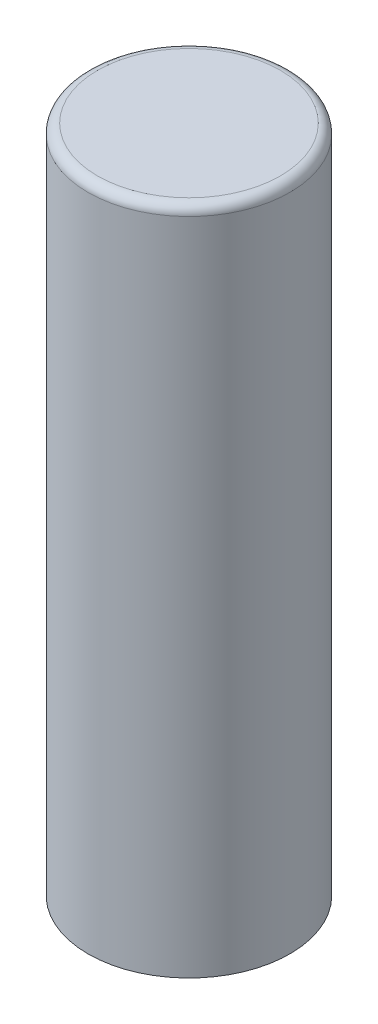
ISO-10303-21;
HEADER;
FILE_DESCRIPTION(('STEP AP214'),'2;1');
FILE_NAME('part.step','',(''),(''),'','','');
FILE_SCHEMA(('AUTOMOTIVE_DESIGN { 1 0 10303 214 1 1 1 1 }'));
ENDSEC;
DATA;
#1=APPLICATION_CONTEXT('core data for automotive mechanical design processes');
#2=APPLICATION_PROTOCOL_DEFINITION('international standard','automotive_design',2000,#1);
#3=PRODUCT_CONTEXT('',#1,'mechanical');
#4=PRODUCT('Part','Part','',(#3));
#5=PRODUCT_RELATED_PRODUCT_CATEGORY('part','',(#4));
#6=PRODUCT_DEFINITION_FORMATION('','',#4);
#7=PRODUCT_DEFINITION_CONTEXT('part definition',#1,'design');
#8=PRODUCT_DEFINITION('design','',#6,#7);
#9=PRODUCT_DEFINITION_SHAPE('','',#8);
#10=(LENGTH_UNIT() NAMED_UNIT(*) SI_UNIT(.MILLI.,.METRE.));
#11=(NAMED_UNIT(*) PLANE_ANGLE_UNIT() SI_UNIT($,.RADIAN.));
#12=(NAMED_UNIT(*) SI_UNIT($,.STERADIAN.) SOLID_ANGLE_UNIT());
#13=UNCERTAINTY_MEASURE_WITH_UNIT(LENGTH_MEASURE(1.E-05),#10,'distance_accuracy_value','');
#14=(GEOMETRIC_REPRESENTATION_CONTEXT(3) GLOBAL_UNCERTAINTY_ASSIGNED_CONTEXT((#13)) GLOBAL_UNIT_ASSIGNED_CONTEXT((#10,
#11,#12)) REPRESENTATION_CONTEXT('',''));
#15=CARTESIAN_POINT('',(0.,0.,0.));
#16=DIRECTION('',(0.,0.,1.));
#17=DIRECTION('',(1.,0.,0.));
#18=AXIS2_PLACEMENT_3D('',#15,#16,#17);
#19=CARTESIAN_POINT('',(0.,70.3,0.));
#20=DIRECTION('',(0.,-1.,0.));
#21=DIRECTION('',(0.,0.,-1.));
#22=AXIS2_PLACEMENT_3D('',#19,#20,#21);
#23=CYLINDRICAL_SURFACE('',#22,10.61);
#24=CARTESIAN_POINT('',(0.,69.3,0.));
#25=DIRECTION('',(0.,1.,0.));
#26=DIRECTION('',(0.,0.,1.));
#27=AXIS2_PLACEMENT_3D('',#24,#25,#26);
#28=CIRCLE('',#27,10.61);
#29=CARTESIAN_POINT('',(0.,69.3,10.61));
#30=VERTEX_POINT('',#29);
#31=EDGE_CURVE('E10',#30,#30,#28,.F.);
#32=ORIENTED_EDGE('',*,*,#31,.T.);
#33=EDGE_LOOP('',(#32));
#34=FACE_BOUND('',#33,.T.);
#35=CARTESIAN_POINT('',(0.,0.,0.));
#36=DIRECTION('',(0.,1.,0.));
#37=DIRECTION('',(0.,0.,1.));
#38=AXIS2_PLACEMENT_3D('',#35,#36,#37);
#39=CIRCLE('',#38,10.61);
#40=CARTESIAN_POINT('',(0.,0.,10.61));
#41=VERTEX_POINT('',#40);
#42=EDGE_CURVE('E48',#41,#41,#39,.T.);
#43=ORIENTED_EDGE('',*,*,#42,.T.);
#44=EDGE_LOOP('',(#43));
#45=FACE_BOUND('',#44,.T.);
#46=ADVANCED_FACE('F37',(#34,#45),#23,.T.);
#47=CARTESIAN_POINT('',(0.,70.3,0.));
#48=DIRECTION('',(0.,1.,0.));
#49=DIRECTION('',(0.,0.,1.));
#50=AXIS2_PLACEMENT_3D('',#47,#48,#49);
#51=PLANE('',#50);
#52=CARTESIAN_POINT('',(0.,70.3,0.));
#53=DIRECTION('',(0.,1.,0.));
#54=DIRECTION('',(0.,0.,1.));
#55=AXIS2_PLACEMENT_3D('',#52,#53,#54);
#56=CIRCLE('',#55,9.61);
#57=CARTESIAN_POINT('',(0.,70.3,9.61));
#58=VERTEX_POINT('',#57);
#59=EDGE_CURVE('E44',#58,#58,#56,.T.);
#60=ORIENTED_EDGE('',*,*,#59,.T.);
#61=EDGE_LOOP('',(#60));
#62=FACE_BOUND('',#61,.T.);
#63=ADVANCED_FACE('F58',(#62),#51,.T.);
#64=CARTESIAN_POINT('',(0.,0.,0.));
#65=DIRECTION('',(0.,1.,0.));
#66=DIRECTION('',(0.,0.,1.));
#67=AXIS2_PLACEMENT_3D('',#64,#65,#66);
#68=PLANE('',#67);
#69=ORIENTED_EDGE('',*,*,#42,.F.);
#70=EDGE_LOOP('',(#69));
#71=FACE_BOUND('',#70,.T.);
#72=ADVANCED_FACE('F56',(#71),#68,.F.);
#73=CARTESIAN_POINT('',(0.,69.3,0.));
#74=DIRECTION('',(0.,1.,0.));
#75=DIRECTION('',(0.,0.,1.));
#76=AXIS2_PLACEMENT_3D('',#73,#74,#75);
#77=TOROIDAL_SURFACE('',#76,9.61,1.);
#78=ORIENTED_EDGE('',*,*,#31,.F.);
#79=EDGE_LOOP('',(#78));
#80=FACE_BOUND('',#79,.T.);
#81=ORIENTED_EDGE('',*,*,#59,.F.);
#82=EDGE_LOOP('',(#81));
#83=FACE_BOUND('',#82,.T.);
#84=ADVANCED_FACE('F39',(#80,#83),#77,.T.);
#85=CLOSED_SHELL('',(#46,#63,#72,#84));
#86=MANIFOLD_SOLID_BREP('B2',#85);
#87=ADVANCED_BREP_SHAPE_REPRESENTATION('',(#18,#86),#14);
#88=SHAPE_DEFINITION_REPRESENTATION(#9,#87);
ENDSEC;
END-ISO-10303-21;
